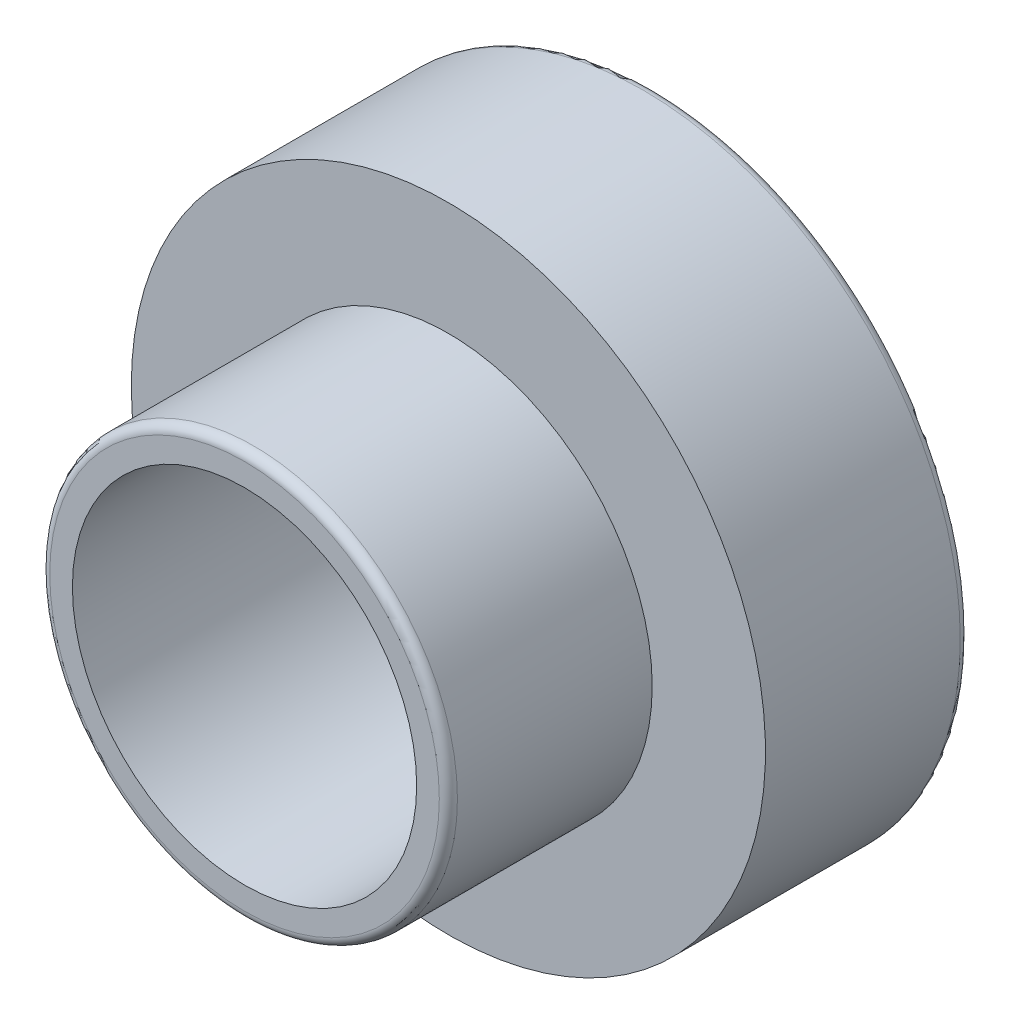
ISO-10303-21;
HEADER;
FILE_DESCRIPTION(('STEP AP214'),'2;1');
FILE_NAME('part.step','',(''),(''),'','','');
FILE_SCHEMA(('AUTOMOTIVE_DESIGN { 1 0 10303 214 1 1 1 1 }'));
ENDSEC;
DATA;
#1=APPLICATION_CONTEXT('core data for automotive mechanical design processes');
#2=APPLICATION_PROTOCOL_DEFINITION('international standard','automotive_design',2000,#1);
#3=PRODUCT_CONTEXT('',#1,'mechanical');
#4=PRODUCT('Part','Part','',(#3));
#5=PRODUCT_RELATED_PRODUCT_CATEGORY('part','',(#4));
#6=PRODUCT_DEFINITION_FORMATION('','',#4);
#7=PRODUCT_DEFINITION_CONTEXT('part definition',#1,'design');
#8=PRODUCT_DEFINITION('design','',#6,#7);
#9=PRODUCT_DEFINITION_SHAPE('','',#8);
#10=(LENGTH_UNIT() NAMED_UNIT(*) SI_UNIT(.MILLI.,.METRE.));
#11=(NAMED_UNIT(*) PLANE_ANGLE_UNIT() SI_UNIT($,.RADIAN.));
#12=(NAMED_UNIT(*) SI_UNIT($,.STERADIAN.) SOLID_ANGLE_UNIT());
#13=UNCERTAINTY_MEASURE_WITH_UNIT(LENGTH_MEASURE(1.E-05),#10,'distance_accuracy_value','');
#14=(GEOMETRIC_REPRESENTATION_CONTEXT(3) GLOBAL_UNCERTAINTY_ASSIGNED_CONTEXT((#13)) GLOBAL_UNIT_ASSIGNED_CONTEXT((#10,
#11,#12)) REPRESENTATION_CONTEXT('',''));
#15=CARTESIAN_POINT('',(0.,0.,0.));
#16=DIRECTION('',(0.,0.,1.));
#17=DIRECTION('',(1.,0.,0.));
#18=AXIS2_PLACEMENT_3D('',#15,#16,#17);
#19=CARTESIAN_POINT('',(0.,0.,90.));
#20=DIRECTION('',(0.,0.,-1.));
#21=DIRECTION('',(-1.,0.,0.));
#22=AXIS2_PLACEMENT_3D('',#19,#20,#21);
#23=CYLINDRICAL_SURFACE('',#22,70.);
#24=CARTESIAN_POINT('',(0.,0.,2.));
#25=DIRECTION('',(0.,0.,1.));
#26=DIRECTION('',(1.,0.,0.));
#27=AXIS2_PLACEMENT_3D('',#24,#25,#26);
#28=CIRCLE('',#27,70.);
#29=CARTESIAN_POINT('',(-70.,0.,1.99999999999999));
#30=VERTEX_POINT('',#29);
#31=EDGE_CURVE('E38',#30,#30,#28,.T.);
#32=CARTESIAN_POINT('',(0.,0.,45.));
#33=DIRECTION('',(0.,0.,1.));
#34=DIRECTION('',(1.,0.,0.));
#35=AXIS2_PLACEMENT_3D('',#32,#33,#34);
#36=CIRCLE('',#35,70.);
#37=CARTESIAN_POINT('',(-70.,0.,45.));
#38=VERTEX_POINT('',#37);
#39=EDGE_CURVE('E55',#38,#38,#36,.T.);
#40=CARTESIAN_POINT('',(-70.,0.,1.99999999999999));
#41=CARTESIAN_POINT('',(-70.,0.,2.44791666666666));
#42=CARTESIAN_POINT('',(-70.,0.,2.89583333333332));
#43=CARTESIAN_POINT('',(-70.,0.,3.79166666666666));
#44=CARTESIAN_POINT('',(-70.,0.,4.23958333333332));
#45=CARTESIAN_POINT('',(-70.,0.,5.13541666666665));
#46=CARTESIAN_POINT('',(-70.,0.,5.58333333333332));
#47=CARTESIAN_POINT('',(-70.,0.,6.47916666666666));
#48=CARTESIAN_POINT('',(-70.,0.,6.92708333333332));
#49=CARTESIAN_POINT('',(-70.,0.,7.82291666666666));
#50=CARTESIAN_POINT('',(-70.,0.,8.27083333333332));
#51=CARTESIAN_POINT('',(-70.,0.,9.16666666666665));
#52=CARTESIAN_POINT('',(-70.,0.,9.61458333333332));
#53=CARTESIAN_POINT('',(-70.,0.,10.5104166666667));
#54=CARTESIAN_POINT('',(-70.,0.,10.9583333333333));
#55=CARTESIAN_POINT('',(-70.,0.,11.8541666666667));
#56=CARTESIAN_POINT('',(-70.,0.,12.3020833333333));
#57=CARTESIAN_POINT('',(-70.,0.,13.1979166666667));
#58=CARTESIAN_POINT('',(-70.,0.,13.6458333333333));
#59=CARTESIAN_POINT('',(-70.,0.,14.5416666666667));
#60=CARTESIAN_POINT('',(-70.,0.,14.9895833333333));
#61=CARTESIAN_POINT('',(-70.,0.,15.8854166666667));
#62=CARTESIAN_POINT('',(-70.,0.,16.3333333333333));
#63=CARTESIAN_POINT('',(-70.,0.,17.2291666666667));
#64=CARTESIAN_POINT('',(-70.,0.,17.6770833333333));
#65=CARTESIAN_POINT('',(-70.,0.,18.5729166666667));
#66=CARTESIAN_POINT('',(-70.,0.,19.0208333333333));
#67=CARTESIAN_POINT('',(-70.,0.,19.9166666666667));
#68=CARTESIAN_POINT('',(-70.,0.,20.3645833333333));
#69=CARTESIAN_POINT('',(-70.,0.,21.2604166666667));
#70=CARTESIAN_POINT('',(-70.,0.,21.7083333333333));
#71=CARTESIAN_POINT('',(-70.,0.,22.6041666666667));
#72=CARTESIAN_POINT('',(-70.,0.,23.0520833333333));
#73=CARTESIAN_POINT('',(-70.,0.,23.9479166666667));
#74=CARTESIAN_POINT('',(-70.,0.,24.3958333333333));
#75=CARTESIAN_POINT('',(-70.,0.,25.2916666666667));
#76=CARTESIAN_POINT('',(-70.,0.,25.7395833333333));
#77=CARTESIAN_POINT('',(-70.,0.,26.6354166666667));
#78=CARTESIAN_POINT('',(-70.,0.,27.0833333333333));
#79=CARTESIAN_POINT('',(-70.,0.,27.9791666666667));
#80=CARTESIAN_POINT('',(-70.,0.,28.4270833333333));
#81=CARTESIAN_POINT('',(-70.,0.,29.3229166666667));
#82=CARTESIAN_POINT('',(-70.,0.,29.7708333333333));
#83=CARTESIAN_POINT('',(-70.,0.,30.6666666666667));
#84=CARTESIAN_POINT('',(-70.,0.,31.1145833333333));
#85=CARTESIAN_POINT('',(-70.,0.,32.0104166666667));
#86=CARTESIAN_POINT('',(-70.,0.,32.4583333333333));
#87=CARTESIAN_POINT('',(-70.,0.,33.3541666666667));
#88=CARTESIAN_POINT('',(-70.,0.,33.8020833333333));
#89=CARTESIAN_POINT('',(-70.,0.,34.6979166666667));
#90=CARTESIAN_POINT('',(-70.,0.,35.1458333333333));
#91=CARTESIAN_POINT('',(-70.,0.,36.0416666666667));
#92=CARTESIAN_POINT('',(-70.,0.,36.4895833333333));
#93=CARTESIAN_POINT('',(-70.,0.,37.3854166666667));
#94=CARTESIAN_POINT('',(-70.,0.,37.8333333333333));
#95=CARTESIAN_POINT('',(-70.,0.,38.7291666666667));
#96=CARTESIAN_POINT('',(-70.,0.,39.1770833333333));
#97=CARTESIAN_POINT('',(-70.,0.,40.0729166666667));
#98=CARTESIAN_POINT('',(-70.,0.,40.5208333333333));
#99=CARTESIAN_POINT('',(-70.,0.,41.4166666666667));
#100=CARTESIAN_POINT('',(-70.,0.,41.8645833333333));
#101=CARTESIAN_POINT('',(-70.,0.,42.7604166666667));
#102=CARTESIAN_POINT('',(-70.,0.,43.2083333333333));
#103=CARTESIAN_POINT('',(-70.,0.,44.1041666666667));
#104=CARTESIAN_POINT('',(-70.,0.,44.5520833333333));
#105=CARTESIAN_POINT('',(-70.,0.,45.));
#106=B_SPLINE_CURVE_WITH_KNOTS('',3,(#40,#41,#42,#43,#44,#45,#46,#47,#48,#49,#50,#51,#52,#53,
#54,#55,#56,#57,#58,#59,#60,#61,#62,#63,#64,#65,#66,#67,#68,#69,#70,#71,#72,#73,#74,#75,#76,#77,
#78,#79,#80,#81,#82,#83,#84,#85,#86,#87,#88,#89,#90,#91,#92,#93,#94,#95,#96,#97,#98,#99,#100,
#101,#102,#103,#104,#105),.UNSPECIFIED.,.F.,.F.,(4,2,2,2,2,2,2,2,2,2,2,2,2,2,2,2,2,2,2,2,2,2,2,
2,2,2,2,2,2,2,2,2,4),(0.,1.34375,2.6875,4.03125,5.375,6.71875,8.0625,9.40625000000001,10.75,
12.09375,13.4375,14.78125,16.125,17.46875,18.8125,20.15625,21.5,22.84375,24.1875,25.53125,
26.875,28.21875,29.5625,30.90625,32.25,33.59375,34.9375,36.28125,37.625,38.96875,40.3125,
41.65625,43.),.UNSPECIFIED.);
#107=EDGE_CURVE('BSEAM31',#30,#38,#106,.T.);
#108=ORIENTED_EDGE('',*,*,#31,.T.);
#109=ORIENTED_EDGE('',*,*,#39,.F.);
#110=ORIENTED_EDGE('',*,*,#107,.T.);
#111=ORIENTED_EDGE('',*,*,#107,.F.);
#112=EDGE_LOOP('',(#108,#110,#109,#111));
#113=FACE_BOUND('',#112,.T.);
#114=ADVANCED_FACE('F31',(#113),#23,.T.);
#115=CARTESIAN_POINT('',(0.,0.,90.));
#116=DIRECTION('',(0.,0.,1.));
#117=DIRECTION('',(1.,0.,0.));
#118=AXIS2_PLACEMENT_3D('',#115,#116,#117);
#119=PLANE('',#118);
#120=CARTESIAN_POINT('',(0.,0.,90.));
#121=DIRECTION('',(0.,0.,1.));
#122=DIRECTION('',(1.,0.,0.));
#123=AXIS2_PLACEMENT_3D('',#120,#121,#122);
#124=CIRCLE('',#123,43.);
#125=CARTESIAN_POINT('',(43.,0.,90.));
#126=VERTEX_POINT('',#125);
#127=EDGE_CURVE('E46',#126,#126,#124,.T.);
#128=ORIENTED_EDGE('',*,*,#127,.T.);
#129=EDGE_LOOP('',(#128));
#130=FACE_BOUND('',#129,.T.);
#131=CARTESIAN_POINT('',(0.,0.,90.));
#132=DIRECTION('',(0.,0.,1.));
#133=DIRECTION('',(1.,0.,0.));
#134=AXIS2_PLACEMENT_3D('',#131,#132,#133);
#135=CIRCLE('',#134,38.);
#136=CARTESIAN_POINT('',(38.,0.,90.));
#137=VERTEX_POINT('',#136);
#138=EDGE_CURVE('E52',#137,#137,#135,.T.);
#139=ORIENTED_EDGE('',*,*,#138,.F.);
#140=EDGE_LOOP('',(#139));
#141=FACE_BOUND('',#140,.T.);
#142=ADVANCED_FACE('F74',(#130,#141),#119,.T.);
#143=CARTESIAN_POINT('',(0.,0.,0.));
#144=DIRECTION('',(0.,0.,1.));
#145=DIRECTION('',(1.,0.,0.));
#146=AXIS2_PLACEMENT_3D('',#143,#144,#145);
#147=PLANE('',#146);
#148=CARTESIAN_POINT('',(0.,0.,0.));
#149=DIRECTION('',(0.,0.,1.));
#150=DIRECTION('',(1.,0.,0.));
#151=AXIS2_PLACEMENT_3D('',#148,#149,#150);
#152=CIRCLE('',#151,68.);
#153=CARTESIAN_POINT('',(68.,0.,0.));
#154=VERTEX_POINT('',#153);
#155=EDGE_CURVE('E10',#154,#154,#152,.F.);
#156=ORIENTED_EDGE('',*,*,#155,.T.);
#157=EDGE_LOOP('',(#156));
#158=FACE_BOUND('',#157,.T.);
#159=CARTESIAN_POINT('',(0.,0.,0.));
#160=DIRECTION('',(0.,0.,1.));
#161=DIRECTION('',(1.,0.,0.));
#162=AXIS2_PLACEMENT_3D('',#159,#160,#161);
#163=CIRCLE('',#162,38.);
#164=CARTESIAN_POINT('',(38.,0.,0.));
#165=VERTEX_POINT('',#164);
#166=EDGE_CURVE('E51',#165,#165,#163,.T.);
#167=ORIENTED_EDGE('',*,*,#166,.T.);
#168=EDGE_LOOP('',(#167));
#169=FACE_BOUND('',#168,.T.);
#170=ADVANCED_FACE('F79',(#158,#169),#147,.F.);
#171=CARTESIAN_POINT('',(0.,0.,0.));
#172=DIRECTION('',(0.,0.,1.));
#173=DIRECTION('',(1.,0.,0.));
#174=AXIS2_PLACEMENT_3D('',#171,#172,#173);
#175=CYLINDRICAL_SURFACE('',#174,38.);
#176=CARTESIAN_POINT('',(38.,0.,0.));
#177=CARTESIAN_POINT('',(38.,0.,0.937499999999998));
#178=CARTESIAN_POINT('',(38.,0.,1.875));
#179=CARTESIAN_POINT('',(38.,0.,3.75));
#180=CARTESIAN_POINT('',(38.,0.,4.6875));
#181=CARTESIAN_POINT('',(38.,0.,6.5625));
#182=CARTESIAN_POINT('',(38.,0.,7.5));
#183=CARTESIAN_POINT('',(38.,0.,9.375));
#184=CARTESIAN_POINT('',(38.,0.,10.3125));
#185=CARTESIAN_POINT('',(38.,0.,12.1875));
#186=CARTESIAN_POINT('',(38.,0.,13.125));
#187=CARTESIAN_POINT('',(38.,0.,15.));
#188=CARTESIAN_POINT('',(38.,0.,15.9375));
#189=CARTESIAN_POINT('',(38.,0.,17.8125));
#190=CARTESIAN_POINT('',(38.,0.,18.75));
#191=CARTESIAN_POINT('',(38.,0.,20.625));
#192=CARTESIAN_POINT('',(38.,0.,21.5625));
#193=CARTESIAN_POINT('',(38.,0.,23.4375));
#194=CARTESIAN_POINT('',(38.,0.,24.375));
#195=CARTESIAN_POINT('',(38.,0.,26.25));
#196=CARTESIAN_POINT('',(38.,0.,27.1875));
#197=CARTESIAN_POINT('',(38.,0.,29.0625));
#198=CARTESIAN_POINT('',(38.,0.,30.));
#199=CARTESIAN_POINT('',(38.,0.,31.875));
#200=CARTESIAN_POINT('',(38.,0.,32.8125));
#201=CARTESIAN_POINT('',(38.,0.,34.6875));
#202=CARTESIAN_POINT('',(38.,0.,35.625));
#203=CARTESIAN_POINT('',(38.,0.,37.5));
#204=CARTESIAN_POINT('',(38.,0.,38.4375));
#205=CARTESIAN_POINT('',(38.,0.,40.3125));
#206=CARTESIAN_POINT('',(38.,0.,41.25));
#207=CARTESIAN_POINT('',(38.,0.,43.125));
#208=CARTESIAN_POINT('',(38.,0.,44.0625));
#209=CARTESIAN_POINT('',(38.,0.,45.9375));
#210=CARTESIAN_POINT('',(38.,0.,46.875));
#211=CARTESIAN_POINT('',(38.,0.,48.75));
#212=CARTESIAN_POINT('',(38.,0.,49.6875));
#213=CARTESIAN_POINT('',(38.,0.,51.5625));
#214=CARTESIAN_POINT('',(38.,0.,52.5));
#215=CARTESIAN_POINT('',(38.,0.,54.375));
#216=CARTESIAN_POINT('',(38.,0.,55.3125));
#217=CARTESIAN_POINT('',(38.,0.,57.1875));
#218=CARTESIAN_POINT('',(38.,0.,58.125));
#219=CARTESIAN_POINT('',(38.,0.,60.));
#220=CARTESIAN_POINT('',(38.,0.,60.9375));
#221=CARTESIAN_POINT('',(38.,0.,62.8125));
#222=CARTESIAN_POINT('',(38.,0.,63.75));
#223=CARTESIAN_POINT('',(38.,0.,65.625));
#224=CARTESIAN_POINT('',(38.,0.,66.5625));
#225=CARTESIAN_POINT('',(38.,0.,68.4375));
#226=CARTESIAN_POINT('',(38.,0.,69.375));
#227=CARTESIAN_POINT('',(38.,0.,71.25));
#228=CARTESIAN_POINT('',(38.,0.,72.1875));
#229=CARTESIAN_POINT('',(38.,0.,74.0625));
#230=CARTESIAN_POINT('',(38.,0.,75.));
#231=CARTESIAN_POINT('',(38.,0.,76.875));
#232=CARTESIAN_POINT('',(38.,0.,77.8125));
#233=CARTESIAN_POINT('',(38.,0.,79.6875));
#234=CARTESIAN_POINT('',(38.,0.,80.625));
#235=CARTESIAN_POINT('',(38.,0.,82.5));
#236=CARTESIAN_POINT('',(38.,0.,83.4375));
#237=CARTESIAN_POINT('',(38.,0.,85.3125));
#238=CARTESIAN_POINT('',(38.,0.,86.25));
#239=CARTESIAN_POINT('',(38.,0.,88.125));
#240=CARTESIAN_POINT('',(38.,0.,89.0625));
#241=CARTESIAN_POINT('',(38.,0.,90.));
#242=B_SPLINE_CURVE_WITH_KNOTS('',3,(#176,#177,#178,#179,#180,#181,#182,#183,#184,#185,#186,
#187,#188,#189,#190,#191,#192,#193,#194,#195,#196,#197,#198,#199,#200,#201,#202,#203,#204,#205,
#206,#207,#208,#209,#210,#211,#212,#213,#214,#215,#216,#217,#218,#219,#220,#221,#222,#223,#224,
#225,#226,#227,#228,#229,#230,#231,#232,#233,#234,#235,#236,#237,#238,#239,#240,#241),
.UNSPECIFIED.,.F.,.F.,(4,2,2,2,2,2,2,2,2,2,2,2,2,2,2,2,2,2,2,2,2,2,2,2,2,2,2,2,2,2,2,2,4),(0.,
2.8125,5.625,8.4375,11.25,14.0625,16.875,19.6875,22.5,25.3125,28.125,30.9375,33.75,36.5625,
39.375,42.1875,45.,47.8125,50.625,53.4375,56.25,59.0625,61.875,64.6875,67.5,70.3125,73.125,
75.9375,78.75,81.5625,84.375,87.1875,90.),.UNSPECIFIED.);
#243=EDGE_CURVE('BSEAM69',#165,#137,#242,.T.);
#244=ORIENTED_EDGE('',*,*,#166,.F.);
#245=ORIENTED_EDGE('',*,*,#138,.T.);
#246=ORIENTED_EDGE('',*,*,#243,.T.);
#247=ORIENTED_EDGE('',*,*,#243,.F.);
#248=EDGE_LOOP('',(#244,#246,#245,#247));
#249=FACE_BOUND('',#248,.T.);
#250=ADVANCED_FACE('F69',(#249),#175,.F.);
#251=CARTESIAN_POINT('',(0.,0.,45.));
#252=DIRECTION('',(0.,0.,1.));
#253=DIRECTION('',(1.,0.,0.));
#254=AXIS2_PLACEMENT_3D('',#251,#252,#253);
#255=PLANE('',#254);
#256=CARTESIAN_POINT('',(0.,0.,45.));
#257=DIRECTION('',(0.,0.,1.));
#258=DIRECTION('',(1.,0.,0.));
#259=AXIS2_PLACEMENT_3D('',#256,#257,#258);
#260=CIRCLE('',#259,45.);
#261=CARTESIAN_POINT('',(45.,0.,45.));
#262=VERTEX_POINT('',#261);
#263=EDGE_CURVE('E60',#262,#262,#260,.T.);
#264=ORIENTED_EDGE('',*,*,#263,.F.);
#265=EDGE_LOOP('',(#264));
#266=FACE_BOUND('',#265,.T.);
#267=ORIENTED_EDGE('',*,*,#39,.T.);
#268=EDGE_LOOP('',(#267));
#269=FACE_BOUND('',#268,.T.);
#270=ADVANCED_FACE('F66',(#266,#269),#255,.T.);
#271=CARTESIAN_POINT('',(0.,0.,45.));
#272=DIRECTION('',(0.,0.,1.));
#273=DIRECTION('',(1.,0.,0.));
#274=AXIS2_PLACEMENT_3D('',#271,#272,#273);
#275=CYLINDRICAL_SURFACE('',#274,45.);
#276=CARTESIAN_POINT('',(0.,0.,88.));
#277=DIRECTION('',(0.,0.,1.));
#278=DIRECTION('',(1.,0.,0.));
#279=AXIS2_PLACEMENT_3D('',#276,#277,#278);
#280=CIRCLE('',#279,45.);
#281=CARTESIAN_POINT('',(45.,0.,88.));
#282=VERTEX_POINT('',#281);
#283=EDGE_CURVE('E42',#282,#282,#280,.F.);
#284=CARTESIAN_POINT('',(45.,0.,88.));
#285=CARTESIAN_POINT('',(45.,0.,87.5520833333333));
#286=CARTESIAN_POINT('',(45.,0.,87.1041666666667));
#287=CARTESIAN_POINT('',(45.,0.,86.2083333333333));
#288=CARTESIAN_POINT('',(45.,0.,85.7604166666667));
#289=CARTESIAN_POINT('',(45.,0.,84.8645833333333));
#290=CARTESIAN_POINT('',(45.,0.,84.4166666666667));
#291=CARTESIAN_POINT('',(45.,0.,83.5208333333333));
#292=CARTESIAN_POINT('',(45.,0.,83.0729166666666));
#293=CARTESIAN_POINT('',(45.,0.,82.1770833333333));
#294=CARTESIAN_POINT('',(45.,0.,81.7291666666667));
#295=CARTESIAN_POINT('',(45.,0.,80.8333333333333));
#296=CARTESIAN_POINT('',(45.,0.,80.3854166666667));
#297=CARTESIAN_POINT('',(45.,0.,79.4895833333333));
#298=CARTESIAN_POINT('',(45.,0.,79.0416666666667));
#299=CARTESIAN_POINT('',(45.,0.,78.1458333333333));
#300=CARTESIAN_POINT('',(45.,0.,77.6979166666667));
#301=CARTESIAN_POINT('',(45.,0.,76.8020833333333));
#302=CARTESIAN_POINT('',(45.,0.,76.3541666666667));
#303=CARTESIAN_POINT('',(45.,0.,75.4583333333333));
#304=CARTESIAN_POINT('',(45.,0.,75.0104166666667));
#305=CARTESIAN_POINT('',(45.,0.,74.1145833333333));
#306=CARTESIAN_POINT('',(45.,0.,73.6666666666667));
#307=CARTESIAN_POINT('',(45.,0.,72.7708333333333));
#308=CARTESIAN_POINT('',(45.,0.,72.3229166666667));
#309=CARTESIAN_POINT('',(45.,0.,71.4270833333333));
#310=CARTESIAN_POINT('',(45.,0.,70.9791666666667));
#311=CARTESIAN_POINT('',(45.,0.,70.0833333333333));
#312=CARTESIAN_POINT('',(45.,0.,69.6354166666667));
#313=CARTESIAN_POINT('',(45.,0.,68.7395833333333));
#314=CARTESIAN_POINT('',(45.,0.,68.2916666666667));
#315=CARTESIAN_POINT('',(45.,0.,67.3958333333333));
#316=CARTESIAN_POINT('',(45.,0.,66.9479166666667));
#317=CARTESIAN_POINT('',(45.,0.,66.0520833333333));
#318=CARTESIAN_POINT('',(45.,0.,65.6041666666667));
#319=CARTESIAN_POINT('',(45.,0.,64.7083333333333));
#320=CARTESIAN_POINT('',(45.,0.,64.2604166666667));
#321=CARTESIAN_POINT('',(45.,0.,63.3645833333333));
#322=CARTESIAN_POINT('',(45.,0.,62.9166666666667));
#323=CARTESIAN_POINT('',(45.,0.,62.0208333333333));
#324=CARTESIAN_POINT('',(45.,0.,61.5729166666667));
#325=CARTESIAN_POINT('',(45.,0.,60.6770833333333));
#326=CARTESIAN_POINT('',(45.,0.,60.2291666666667));
#327=CARTESIAN_POINT('',(45.,0.,59.3333333333333));
#328=CARTESIAN_POINT('',(45.,0.,58.8854166666667));
#329=CARTESIAN_POINT('',(45.,0.,57.9895833333333));
#330=CARTESIAN_POINT('',(45.,0.,57.5416666666667));
#331=CARTESIAN_POINT('',(45.,0.,56.6458333333333));
#332=CARTESIAN_POINT('',(45.,0.,56.1979166666667));
#333=CARTESIAN_POINT('',(45.,0.,55.3020833333333));
#334=CARTESIAN_POINT('',(45.,0.,54.8541666666667));
#335=CARTESIAN_POINT('',(45.,0.,53.9583333333333));
#336=CARTESIAN_POINT('',(45.,0.,53.5104166666667));
#337=CARTESIAN_POINT('',(45.,0.,52.6145833333333));
#338=CARTESIAN_POINT('',(45.,0.,52.1666666666667));
#339=CARTESIAN_POINT('',(45.,0.,51.2708333333333));
#340=CARTESIAN_POINT('',(45.,0.,50.8229166666667));
#341=CARTESIAN_POINT('',(45.,0.,49.9270833333333));
#342=CARTESIAN_POINT('',(45.,0.,49.4791666666667));
#343=CARTESIAN_POINT('',(45.,0.,48.5833333333333));
#344=CARTESIAN_POINT('',(45.,0.,48.1354166666667));
#345=CARTESIAN_POINT('',(45.,0.,47.2395833333333));
#346=CARTESIAN_POINT('',(45.,0.,46.7916666666667));
#347=CARTESIAN_POINT('',(45.,0.,45.8958333333333));
#348=CARTESIAN_POINT('',(45.,0.,45.4479166666667));
#349=CARTESIAN_POINT('',(45.,0.,45.));
#350=B_SPLINE_CURVE_WITH_KNOTS('',3,(#284,#285,#286,#287,#288,#289,#290,#291,#292,#293,#294,
#295,#296,#297,#298,#299,#300,#301,#302,#303,#304,#305,#306,#307,#308,#309,#310,#311,#312,#313,
#314,#315,#316,#317,#318,#319,#320,#321,#322,#323,#324,#325,#326,#327,#328,#329,#330,#331,#332,
#333,#334,#335,#336,#337,#338,#339,#340,#341,#342,#343,#344,#345,#346,#347,#348,#349),
.UNSPECIFIED.,.F.,.F.,(4,2,2,2,2,2,2,2,2,2,2,2,2,2,2,2,2,2,2,2,2,2,2,2,2,2,2,2,2,2,2,2,4),(0.,
1.34375,2.68750000000001,4.03125000000001,5.375,6.71875,8.0625,9.40625000000001,10.75,12.09375,
13.4375,14.78125,16.125,17.46875,18.8125,20.15625,21.5,22.84375,24.1875,25.53125,26.875,
28.21875,29.5625,30.90625,32.25,33.59375,34.9375,36.28125,37.625,38.96875,40.3125,41.65625,43.),.UNSPECIFIED.);
#351=EDGE_CURVE('BSEAM64',#282,#262,#350,.T.);
#352=ORIENTED_EDGE('',*,*,#283,.T.);
#353=ORIENTED_EDGE('',*,*,#263,.T.);
#354=ORIENTED_EDGE('',*,*,#351,.T.);
#355=ORIENTED_EDGE('',*,*,#351,.F.);
#356=EDGE_LOOP('',(#352,#354,#353,#355));
#357=FACE_BOUND('',#356,.T.);
#358=ADVANCED_FACE('F64',(#357),#275,.T.);
#359=CARTESIAN_POINT('',(0.,0.,88.));
#360=DIRECTION('',(0.,0.,1.));
#361=DIRECTION('',(1.,0.,0.));
#362=AXIS2_PLACEMENT_3D('',#359,#360,#361);
#363=TOROIDAL_SURFACE('',#362,43.,2.);
#364=ORIENTED_EDGE('',*,*,#283,.F.);
#365=EDGE_LOOP('',(#364));
#366=FACE_BOUND('',#365,.T.);
#367=ORIENTED_EDGE('',*,*,#127,.F.);
#368=EDGE_LOOP('',(#367));
#369=FACE_BOUND('',#368,.T.);
#370=ADVANCED_FACE('F83',(#366,#369),#363,.T.);
#371=CARTESIAN_POINT('',(0.,0.,2.));
#372=DIRECTION('',(0.,0.,1.));
#373=DIRECTION('',(1.,0.,0.));
#374=AXIS2_PLACEMENT_3D('',#371,#372,#373);
#375=TOROIDAL_SURFACE('',#374,68.,2.);
#376=ORIENTED_EDGE('',*,*,#155,.F.);
#377=EDGE_LOOP('',(#376));
#378=FACE_BOUND('',#377,.T.);
#379=ORIENTED_EDGE('',*,*,#31,.F.);
#380=EDGE_LOOP('',(#379));
#381=FACE_BOUND('',#380,.T.);
#382=ADVANCED_FACE('F33',(#378,#381),#375,.T.);
#383=CLOSED_SHELL('',(#114,#142,#170,#250,#270,#358,#370,#382));
#384=MANIFOLD_SOLID_BREP('B2',#383);
#385=ADVANCED_BREP_SHAPE_REPRESENTATION('',(#18,#384),#14);
#386=SHAPE_DEFINITION_REPRESENTATION(#9,#385);
ENDSEC;
END-ISO-10303-21;
